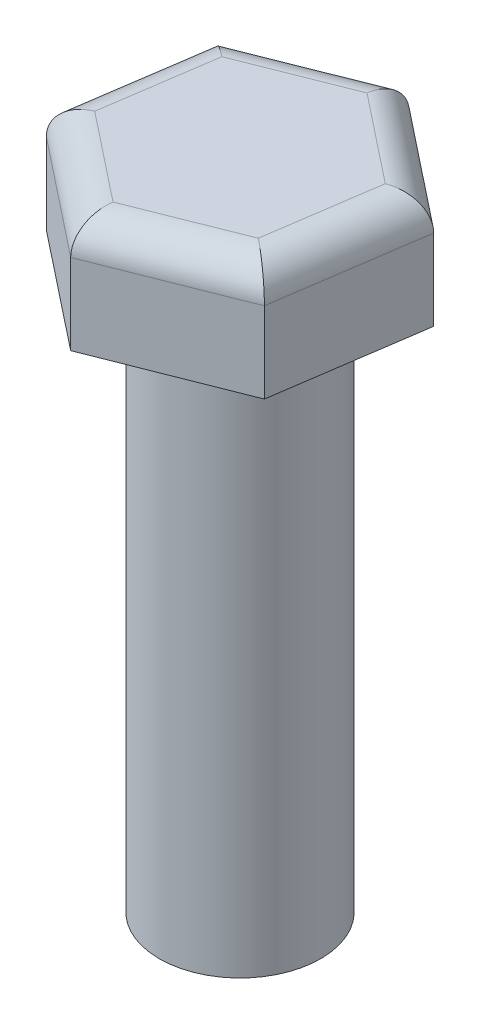
ISO-10303-21;
HEADER;
FILE_DESCRIPTION(('STEP AP214'),'2;1');
FILE_NAME('part.step','',(''),(''),'','','');
FILE_SCHEMA(('AUTOMOTIVE_DESIGN { 1 0 10303 214 1 1 1 1 }'));
ENDSEC;
DATA;
#1=APPLICATION_CONTEXT('core data for automotive mechanical design processes');
#2=APPLICATION_PROTOCOL_DEFINITION('international standard','automotive_design',2000,#1);
#3=PRODUCT_CONTEXT('',#1,'mechanical');
#4=PRODUCT('Part','Part','',(#3));
#5=PRODUCT_RELATED_PRODUCT_CATEGORY('part','',(#4));
#6=PRODUCT_DEFINITION_FORMATION('','',#4);
#7=PRODUCT_DEFINITION_CONTEXT('part definition',#1,'design');
#8=PRODUCT_DEFINITION('design','',#6,#7);
#9=PRODUCT_DEFINITION_SHAPE('','',#8);
#10=(LENGTH_UNIT() NAMED_UNIT(*) SI_UNIT(.MILLI.,.METRE.));
#11=(NAMED_UNIT(*) PLANE_ANGLE_UNIT() SI_UNIT($,.RADIAN.));
#12=(NAMED_UNIT(*) SI_UNIT($,.STERADIAN.) SOLID_ANGLE_UNIT());
#13=UNCERTAINTY_MEASURE_WITH_UNIT(LENGTH_MEASURE(1.E-05),#10,'distance_accuracy_value','');
#14=(GEOMETRIC_REPRESENTATION_CONTEXT(3) GLOBAL_UNCERTAINTY_ASSIGNED_CONTEXT((#13)) GLOBAL_UNIT_ASSIGNED_CONTEXT((#10,
#11,#12)) REPRESENTATION_CONTEXT('',''));
#15=CARTESIAN_POINT('',(0.,0.,0.));
#16=DIRECTION('',(0.,0.,1.));
#17=DIRECTION('',(1.,0.,0.));
#18=AXIS2_PLACEMENT_3D('',#15,#16,#17);
#19=CARTESIAN_POINT('',(0.,17.,0.));
#20=DIRECTION('',(0.,-1.,0.));
#21=DIRECTION('',(0.,0.,-1.));
#22=AXIS2_PLACEMENT_3D('',#19,#20,#21);
#23=CYLINDRICAL_SURFACE('',#22,2.5);
#24=CARTESIAN_POINT('',(0.,17.,0.));
#25=DIRECTION('',(0.,1.,0.));
#26=DIRECTION('',(0.,0.,1.));
#27=AXIS2_PLACEMENT_3D('',#24,#25,#26);
#28=CIRCLE('',#27,2.5);
#29=CARTESIAN_POINT('',(0.,17.,2.5));
#30=VERTEX_POINT('',#29);
#31=EDGE_CURVE('E151',#30,#30,#28,.T.);
#32=ORIENTED_EDGE('',*,*,#31,.F.);
#33=EDGE_LOOP('',(#32));
#34=FACE_BOUND('',#33,.T.);
#35=CARTESIAN_POINT('',(0.,0.,0.));
#36=DIRECTION('',(0.,1.,0.));
#37=DIRECTION('',(0.,0.,1.));
#38=AXIS2_PLACEMENT_3D('',#35,#36,#37);
#39=CIRCLE('',#38,2.5);
#40=CARTESIAN_POINT('',(0.,0.,2.5));
#41=VERTEX_POINT('',#40);
#42=EDGE_CURVE('E114',#41,#41,#39,.T.);
#43=ORIENTED_EDGE('',*,*,#42,.T.);
#44=EDGE_LOOP('',(#43));
#45=FACE_BOUND('',#44,.T.);
#46=ADVANCED_FACE('F31',(#34,#45),#23,.T.);
#47=CARTESIAN_POINT('',(0.,0.,0.));
#48=DIRECTION('',(0.,1.,0.));
#49=DIRECTION('',(0.,0.,1.));
#50=AXIS2_PLACEMENT_3D('',#47,#48,#49);
#51=PLANE('',#50);
#52=ORIENTED_EDGE('',*,*,#42,.F.);
#53=EDGE_LOOP('',(#52));
#54=FACE_BOUND('',#53,.T.);
#55=ADVANCED_FACE('F226',(#54),#51,.F.);
#56=CARTESIAN_POINT('',(3.62143570471053,17.,2.86679904597115));
#57=DIRECTION('',(0.,1.,0.));
#58=DIRECTION('',(0.,0.,1.));
#59=AXIS2_PLACEMENT_3D('',#56,#57,#58);
#60=PLANE('',#59);
#61=DIRECTION('',(0.929556735926005,0.,-0.368679094463723));
#62=VECTOR('',#61,1.);
#63=CARTESIAN_POINT('',(-0.672002949000746,17.,4.56965484143689));
#64=LINE('',#63,#62);
#65=CARTESIAN_POINT('',(-0.672002949000746,17.,4.56965484143689));
#66=VERTEX_POINT('',#65);
#67=CARTESIAN_POINT('',(3.62143570471053,17.,2.86679904597115));
#68=VERTEX_POINT('',#67);
#69=EDGE_CURVE('E122',#66,#68,#64,.T.);
#70=ORIENTED_EDGE('',*,*,#69,.F.);
#71=DIRECTION('',(0.784063829612829,0.,0.620680200339002));
#72=VECTOR('',#71,1.);
#73=CARTESIAN_POINT('',(-4.29343865371127,17.,1.70285579546574));
#74=LINE('',#73,#72);
#75=CARTESIAN_POINT('',(-4.29343865371127,17.,1.70285579546574));
#76=VERTEX_POINT('',#75);
#77=EDGE_CURVE('E141',#76,#66,#74,.T.);
#78=ORIENTED_EDGE('',*,*,#77,.F.);
#79=DIRECTION('',(-0.145492906313176,0.,0.989359294802725));
#80=VECTOR('',#79,1.);
#81=CARTESIAN_POINT('',(-3.62143570471053,17.,-2.86679904597115));
#82=LINE('',#81,#80);
#83=CARTESIAN_POINT('',(-3.62143570471053,17.,-2.86679904597115));
#84=VERTEX_POINT('',#83);
#85=EDGE_CURVE('E138',#84,#76,#82,.T.);
#86=ORIENTED_EDGE('',*,*,#85,.F.);
#87=DIRECTION('',(-0.929556735926005,0.,0.368679094463723));
#88=VECTOR('',#87,1.);
#89=CARTESIAN_POINT('',(0.672002949000745,17.,-4.56965484143689));
#90=LINE('',#89,#88);
#91=CARTESIAN_POINT('',(0.672002949000745,17.,-4.56965484143689));
#92=VERTEX_POINT('',#91);
#93=EDGE_CURVE('E135',#92,#84,#90,.T.);
#94=ORIENTED_EDGE('',*,*,#93,.F.);
#95=DIRECTION('',(-0.78406382961283,0.,-0.620680200339002));
#96=VECTOR('',#95,1.);
#97=CARTESIAN_POINT('',(4.29343865371127,17.,-1.70285579546574));
#98=LINE('',#97,#96);
#99=CARTESIAN_POINT('',(4.29343865371127,17.,-1.70285579546574));
#100=VERTEX_POINT('',#99);
#101=EDGE_CURVE('E125',#100,#92,#98,.T.);
#102=ORIENTED_EDGE('',*,*,#101,.F.);
#103=DIRECTION('',(0.145492906313176,0.,-0.989359294802725));
#104=VECTOR('',#103,1.);
#105=CARTESIAN_POINT('',(3.62143570471053,17.,2.86679904597115));
#106=LINE('',#105,#104);
#107=EDGE_CURVE('E106',#68,#100,#106,.T.);
#108=ORIENTED_EDGE('',*,*,#107,.F.);
#109=EDGE_LOOP('',(#70,#78,#86,#94,#102,#108));
#110=FACE_BOUND('',#109,.T.);
#111=ORIENTED_EDGE('',*,*,#31,.T.);
#112=EDGE_LOOP('',(#111));
#113=FACE_BOUND('',#112,.T.);
#114=ADVANCED_FACE('F119',(#110,#113),#60,.F.);
#115=CARTESIAN_POINT('',(-0.672002949000746,20.5,4.56965484143689));
#116=DIRECTION('',(-0.368679094463723,0.,-0.929556735926005));
#117=DIRECTION('',(-0.929556735926006,0.,0.368679094463723));
#118=AXIS2_PLACEMENT_3D('',#115,#116,#117);
#119=PLANE('',#118);
#120=DIRECTION('',(0.,-1.,0.));
#121=VECTOR('',#120,1.);
#122=CARTESIAN_POINT('',(3.62143570471053,20.5,2.86679904597115));
#123=LINE('',#122,#121);
#124=CARTESIAN_POINT('',(3.62143570471053,19.5,2.86679904597115));
#125=VERTEX_POINT('',#124);
#126=EDGE_CURVE('E102',#125,#68,#123,.T.);
#127=ORIENTED_EDGE('',*,*,#126,.F.);
#128=DIRECTION('',(0.929556735926006,0.,-0.368679094463723));
#129=VECTOR('',#128,1.);
#130=CARTESIAN_POINT('',(-0.672002949000747,19.5,4.5696548414369));
#131=LINE('',#130,#129);
#132=CARTESIAN_POINT('',(-0.672002949000746,19.5,4.56965484143689));
#133=VERTEX_POINT('',#132);
#134=EDGE_CURVE('E169',#125,#133,#131,.F.);
#135=ORIENTED_EDGE('',*,*,#134,.T.);
#136=DIRECTION('',(0.,-1.,0.));
#137=VECTOR('',#136,1.);
#138=CARTESIAN_POINT('',(-0.672002949000746,20.5,4.56965484143689));
#139=LINE('',#138,#137);
#140=EDGE_CURVE('E128',#133,#66,#139,.T.);
#141=ORIENTED_EDGE('',*,*,#140,.T.);
#142=ORIENTED_EDGE('',*,*,#69,.T.);
#143=EDGE_LOOP('',(#127,#135,#141,#142));
#144=FACE_BOUND('',#143,.T.);
#145=ADVANCED_FACE('F127',(#144),#119,.F.);
#146=CARTESIAN_POINT('',(3.62143570471053,20.5,2.86679904597115));
#147=DIRECTION('',(-0.989359294802725,0.,-0.145492906313176));
#148=DIRECTION('',(-0.145492906313176,0.,0.989359294802725));
#149=AXIS2_PLACEMENT_3D('',#146,#147,#148);
#150=PLANE('',#149);
#151=DIRECTION('',(0.,-1.,0.));
#152=VECTOR('',#151,1.);
#153=CARTESIAN_POINT('',(4.29343865371127,20.5,-1.70285579546574));
#154=LINE('',#153,#152);
#155=CARTESIAN_POINT('',(4.29343865371127,19.5,-1.70285579546574));
#156=VERTEX_POINT('',#155);
#157=EDGE_CURVE('E115',#156,#100,#154,.T.);
#158=ORIENTED_EDGE('',*,*,#157,.F.);
#159=DIRECTION('',(0.145492906313176,0.,-0.989359294802725));
#160=VECTOR('',#159,1.);
#161=CARTESIAN_POINT('',(3.62143570471053,19.5,2.86679904597115));
#162=LINE('',#161,#160);
#163=EDGE_CURVE('E109',#156,#125,#162,.F.);
#164=ORIENTED_EDGE('',*,*,#163,.T.);
#165=ORIENTED_EDGE('',*,*,#126,.T.);
#166=ORIENTED_EDGE('',*,*,#107,.T.);
#167=EDGE_LOOP('',(#158,#164,#165,#166));
#168=FACE_BOUND('',#167,.T.);
#169=ADVANCED_FACE('F105',(#168),#150,.F.);
#170=CARTESIAN_POINT('',(4.29343865371127,20.5,-1.70285579546574));
#171=DIRECTION('',(-0.620680200339002,0.,0.78406382961283));
#172=DIRECTION('',(0.78406382961283,0.,0.620680200339002));
#173=AXIS2_PLACEMENT_3D('',#170,#171,#172);
#174=PLANE('',#173);
#175=DIRECTION('',(0.,-1.,0.));
#176=VECTOR('',#175,1.);
#177=CARTESIAN_POINT('',(0.672002949000745,20.5,-4.56965484143689));
#178=LINE('',#177,#176);
#179=CARTESIAN_POINT('',(0.672002949000745,19.5,-4.56965484143689));
#180=VERTEX_POINT('',#179);
#181=EDGE_CURVE('E148',#180,#92,#178,.T.);
#182=ORIENTED_EDGE('',*,*,#181,.F.);
#183=DIRECTION('',(-0.78406382961283,0.,-0.620680200339002));
#184=VECTOR('',#183,1.);
#185=CARTESIAN_POINT('',(4.29343865371127,19.5,-1.70285579546574));
#186=LINE('',#185,#184);
#187=EDGE_CURVE('E172',#180,#156,#186,.F.);
#188=ORIENTED_EDGE('',*,*,#187,.T.);
#189=ORIENTED_EDGE('',*,*,#157,.T.);
#190=ORIENTED_EDGE('',*,*,#101,.T.);
#191=EDGE_LOOP('',(#182,#188,#189,#190));
#192=FACE_BOUND('',#191,.T.);
#193=ADVANCED_FACE('F216',(#192),#174,.F.);
#194=CARTESIAN_POINT('',(0.672002949000745,20.5,-4.56965484143689));
#195=DIRECTION('',(0.368679094463723,0.,0.929556735926005));
#196=DIRECTION('',(0.929556735926006,0.,-0.368679094463723));
#197=AXIS2_PLACEMENT_3D('',#194,#195,#196);
#198=PLANE('',#197);
#199=DIRECTION('',(0.,-1.,0.));
#200=VECTOR('',#199,1.);
#201=CARTESIAN_POINT('',(-3.62143570471053,20.5,-2.86679904597115));
#202=LINE('',#201,#200);
#203=CARTESIAN_POINT('',(-3.62143570471053,19.5,-2.86679904597115));
#204=VERTEX_POINT('',#203);
#205=EDGE_CURVE('E146',#204,#84,#202,.T.);
#206=ORIENTED_EDGE('',*,*,#205,.F.);
#207=DIRECTION('',(-0.929556735926006,0.,0.368679094463723));
#208=VECTOR('',#207,1.);
#209=CARTESIAN_POINT('',(0.672002949000745,19.5,-4.56965484143689));
#210=LINE('',#209,#208);
#211=EDGE_CURVE('E174',#204,#180,#210,.F.);
#212=ORIENTED_EDGE('',*,*,#211,.T.);
#213=ORIENTED_EDGE('',*,*,#181,.T.);
#214=ORIENTED_EDGE('',*,*,#93,.T.);
#215=EDGE_LOOP('',(#206,#212,#213,#214));
#216=FACE_BOUND('',#215,.T.);
#217=ADVANCED_FACE('F213',(#216),#198,.F.);
#218=CARTESIAN_POINT('',(-3.62143570471053,20.5,-2.86679904597115));
#219=DIRECTION('',(0.989359294802725,0.,0.145492906313176));
#220=DIRECTION('',(0.145492906313176,0.,-0.989359294802725));
#221=AXIS2_PLACEMENT_3D('',#218,#219,#220);
#222=PLANE('',#221);
#223=DIRECTION('',(0.,-1.,0.));
#224=VECTOR('',#223,1.);
#225=CARTESIAN_POINT('',(-4.29343865371127,20.5,1.70285579546574));
#226=LINE('',#225,#224);
#227=CARTESIAN_POINT('',(-4.29343865371127,19.5,1.70285579546574));
#228=VERTEX_POINT('',#227);
#229=EDGE_CURVE('E144',#228,#76,#226,.T.);
#230=ORIENTED_EDGE('',*,*,#229,.F.);
#231=DIRECTION('',(-0.145492906313176,0.,0.989359294802725));
#232=VECTOR('',#231,1.);
#233=CARTESIAN_POINT('',(-3.62143570471053,19.5,-2.86679904597115));
#234=LINE('',#233,#232);
#235=EDGE_CURVE('E40',#228,#204,#234,.F.);
#236=ORIENTED_EDGE('',*,*,#235,.T.);
#237=ORIENTED_EDGE('',*,*,#205,.T.);
#238=ORIENTED_EDGE('',*,*,#85,.T.);
#239=EDGE_LOOP('',(#230,#236,#237,#238));
#240=FACE_BOUND('',#239,.T.);
#241=ADVANCED_FACE('F211',(#240),#222,.F.);
#242=CARTESIAN_POINT('',(-4.29343865371127,20.5,1.70285579546574));
#243=DIRECTION('',(0.620680200339002,0.,-0.784063829612829));
#244=DIRECTION('',(-0.784063829612829,0.,-0.620680200339002));
#245=AXIS2_PLACEMENT_3D('',#242,#243,#244);
#246=PLANE('',#245);
#247=ORIENTED_EDGE('',*,*,#140,.F.);
#248=DIRECTION('',(0.784063829612829,0.,0.620680200339002));
#249=VECTOR('',#248,1.);
#250=CARTESIAN_POINT('',(-4.29343865371127,19.5,1.70285579546574));
#251=LINE('',#250,#249);
#252=EDGE_CURVE('E11',#133,#228,#251,.F.);
#253=ORIENTED_EDGE('',*,*,#252,.T.);
#254=ORIENTED_EDGE('',*,*,#229,.T.);
#255=ORIENTED_EDGE('',*,*,#77,.T.);
#256=EDGE_LOOP('',(#247,#253,#254,#255));
#257=FACE_BOUND('',#256,.T.);
#258=ADVANCED_FACE('F209',(#257),#246,.F.);
#259=CARTESIAN_POINT('',(3.62143570471053,20.5,2.86679904597115));
#260=DIRECTION('',(0.,1.,0.));
#261=DIRECTION('',(0.,0.,1.));
#262=AXIS2_PLACEMENT_3D('',#259,#260,#261);
#263=PLANE('',#262);
#264=DIRECTION('',(0.784063829612829,0.,0.620680200339002));
#265=VECTOR('',#264,1.);
#266=CARTESIAN_POINT('',(-0.0513227486617434,20.5,3.78559101182407));
#267=LINE('',#266,#265);
#268=CARTESIAN_POINT('',(-3.22007899028345,20.5,1.27714184659931));
#269=VERTEX_POINT('',#268);
#270=CARTESIAN_POINT('',(-0.50400221175056,20.5,3.42724113107767));
#271=VERTEX_POINT('',#270);
#272=EDGE_CURVE('E154',#269,#271,#267,.T.);
#273=ORIENTED_EDGE('',*,*,#272,.T.);
#274=DIRECTION('',(0.929556735926006,0.,-0.368679094463723));
#275=VECTOR('',#274,1.);
#276=CARTESIAN_POINT('',(3.25275661024681,20.5,1.93724231004515));
#277=LINE('',#276,#275);
#278=CARTESIAN_POINT('',(2.7160767785329,20.5,2.15009928447836));
#279=VERTEX_POINT('',#278);
#280=EDGE_CURVE('E166',#271,#279,#277,.T.);
#281=ORIENTED_EDGE('',*,*,#280,.T.);
#282=DIRECTION('',(0.145492906313176,0.,-0.989359294802725));
#283=VECTOR('',#282,1.);
#284=CARTESIAN_POINT('',(3.30407935890855,20.5,-1.84834870177892));
#285=LINE('',#284,#283);
#286=CARTESIAN_POINT('',(3.22007899028345,20.5,-1.27714184659931));
#287=VERTEX_POINT('',#286);
#288=EDGE_CURVE('E164',#279,#287,#285,.T.);
#289=ORIENTED_EDGE('',*,*,#288,.T.);
#290=DIRECTION('',(-0.78406382961283,0.,-0.620680200339002));
#291=VECTOR('',#290,1.);
#292=CARTESIAN_POINT('',(0.0513227486617432,20.5,-3.78559101182406));
#293=LINE('',#292,#291);
#294=CARTESIAN_POINT('',(0.504002211750558,20.5,-3.42724113107767));
#295=VERTEX_POINT('',#294);
#296=EDGE_CURVE('E162',#287,#295,#293,.T.);
#297=ORIENTED_EDGE('',*,*,#296,.T.);
#298=DIRECTION('',(-0.929556735926006,0.,0.368679094463723));
#299=VECTOR('',#298,1.);
#300=CARTESIAN_POINT('',(-3.25275661024681,20.5,-1.93724231004515));
#301=LINE('',#300,#299);
#302=CARTESIAN_POINT('',(-2.7160767785329,20.5,-2.15009928447836));
#303=VERTEX_POINT('',#302);
#304=EDGE_CURVE('E160',#295,#303,#301,.T.);
#305=ORIENTED_EDGE('',*,*,#304,.T.);
#306=DIRECTION('',(-0.145492906313176,0.,0.989359294802725));
#307=VECTOR('',#306,1.);
#308=CARTESIAN_POINT('',(-3.30407935890855,20.5,1.84834870177892));
#309=LINE('',#308,#307);
#310=EDGE_CURVE('E158',#303,#269,#309,.T.);
#311=ORIENTED_EDGE('',*,*,#310,.T.);
#312=EDGE_LOOP('',(#273,#281,#289,#297,#305,#311));
#313=FACE_BOUND('',#312,.T.);
#314=ADVANCED_FACE('F199',(#313),#263,.T.);
#315=CARTESIAN_POINT('',(1.04068204346447,19.5,-3.64009810551089));
#316=DIRECTION('',(0.929556735926006,0.,-0.368679094463723));
#317=DIRECTION('',(-0.368679094463723,0.,-0.929556735926006));
#318=AXIS2_PLACEMENT_3D('',#315,#316,#317);
#319=CYLINDRICAL_SURFACE('',#318,1.);
#320=CARTESIAN_POINT('',(0.504002211750557,19.5,-3.42724113107767));
#321=DIRECTION('',(0.989359294802725,0.,0.145492906313176));
#322=DIRECTION('',(0.145492906313176,0.,-0.989359294802725));
#323=AXIS2_PLACEMENT_3D('',#320,#321,#322);
#324=ELLIPSE('',#323,1.15470053837925,1.);
#325=EDGE_CURVE('E132',#180,#295,#324,.T.);
#326=ORIENTED_EDGE('',*,*,#325,.F.);
#327=ORIENTED_EDGE('',*,*,#211,.F.);
#328=CARTESIAN_POINT('',(-2.7160767785329,19.5,-2.15009928447836));
#329=DIRECTION('',(0.620680200339002,0.,-0.784063829612829));
#330=DIRECTION('',(-0.784063829612829,0.,-0.620680200339002));
#331=AXIS2_PLACEMENT_3D('',#328,#329,#330);
#332=ELLIPSE('',#331,1.15470053837925,1.);
#333=EDGE_CURVE('E35',#303,#204,#332,.F.);
#334=ORIENTED_EDGE('',*,*,#333,.F.);
#335=ORIENTED_EDGE('',*,*,#304,.F.);
#336=EDGE_LOOP('',(#326,#327,#334,#335));
#337=FACE_BOUND('',#336,.T.);
#338=ADVANCED_FACE('F33',(#337),#319,.T.);
#339=CARTESIAN_POINT('',(-3.30407935890855,19.5,1.84834870177892));
#340=DIRECTION('',(0.145492906313176,0.,-0.989359294802725));
#341=DIRECTION('',(-0.989359294802725,0.,-0.145492906313176));
#342=AXIS2_PLACEMENT_3D('',#339,#340,#341);
#343=CYLINDRICAL_SURFACE('',#342,1.);
#344=ORIENTED_EDGE('',*,*,#333,.T.);
#345=ORIENTED_EDGE('',*,*,#235,.F.);
#346=CARTESIAN_POINT('',(-3.22007899028345,19.5,1.27714184659931));
#347=DIRECTION('',(-0.368679094463723,0.,-0.929556735926005));
#348=DIRECTION('',(-0.929556735926006,0.,0.368679094463723));
#349=AXIS2_PLACEMENT_3D('',#346,#347,#348);
#350=ELLIPSE('',#349,1.15470053837925,1.);
#351=EDGE_CURVE('E184',#269,#228,#350,.F.);
#352=ORIENTED_EDGE('',*,*,#351,.F.);
#353=ORIENTED_EDGE('',*,*,#310,.F.);
#354=EDGE_LOOP('',(#344,#345,#352,#353));
#355=FACE_BOUND('',#354,.T.);
#356=ADVANCED_FACE('F247',(#355),#343,.T.);
#357=CARTESIAN_POINT('',(5.48347630572753,19.5,0.514607557132661));
#358=DIRECTION('',(0.78406382961283,0.,0.620680200339002));
#359=DIRECTION('',(0.620680200339002,0.,-0.78406382961283));
#360=AXIS2_PLACEMENT_3D('',#357,#358,#359);
#361=CYLINDRICAL_SURFACE('',#360,1.);
#362=ORIENTED_EDGE('',*,*,#325,.T.);
#363=ORIENTED_EDGE('',*,*,#296,.F.);
#364=CARTESIAN_POINT('',(3.22007899028345,19.5,-1.27714184659931));
#365=DIRECTION('',(0.368679094463723,0.,0.929556735926006));
#366=DIRECTION('',(0.929556735926005,0.,-0.368679094463723));
#367=AXIS2_PLACEMENT_3D('',#364,#365,#366);
#368=ELLIPSE('',#367,1.15470053837925,1.);
#369=EDGE_CURVE('E181',#156,#287,#368,.T.);
#370=ORIENTED_EDGE('',*,*,#369,.F.);
#371=ORIENTED_EDGE('',*,*,#187,.F.);
#372=EDGE_LOOP('',(#362,#363,#370,#371));
#373=FACE_BOUND('',#372,.T.);
#374=ADVANCED_FACE('F191',(#373),#361,.T.);
#375=CARTESIAN_POINT('',(1.75939510369352,19.5,5.21899053480964));
#376=DIRECTION('',(-0.784063829612829,0.,-0.620680200339002));
#377=DIRECTION('',(-0.620680200339002,0.,0.784063829612829));
#378=AXIS2_PLACEMENT_3D('',#375,#376,#377);
#379=CYLINDRICAL_SURFACE('',#378,1.);
#380=ORIENTED_EDGE('',*,*,#351,.T.);
#381=ORIENTED_EDGE('',*,*,#252,.F.);
#382=CARTESIAN_POINT('',(-0.50400221175056,19.5,3.42724113107767));
#383=DIRECTION('',(-0.989359294802725,0.,-0.145492906313176));
#384=DIRECTION('',(0.145492906313176,0.,-0.989359294802725));
#385=AXIS2_PLACEMENT_3D('',#382,#383,#384);
#386=ELLIPSE('',#385,1.15470053837925,1.);
#387=EDGE_CURVE('E179',#271,#133,#386,.F.);
#388=ORIENTED_EDGE('',*,*,#387,.F.);
#389=ORIENTED_EDGE('',*,*,#272,.F.);
#390=EDGE_LOOP('',(#380,#381,#388,#389));
#391=FACE_BOUND('',#390,.T.);
#392=ADVANCED_FACE('F242',(#391),#379,.T.);
#393=CARTESIAN_POINT('',(2.6320764099078,19.5,2.72130613965797));
#394=DIRECTION('',(-0.145492906313176,0.,0.989359294802725));
#395=DIRECTION('',(0.989359294802725,0.,0.145492906313176));
#396=AXIS2_PLACEMENT_3D('',#393,#394,#395);
#397=CYLINDRICAL_SURFACE('',#396,1.);
#398=ORIENTED_EDGE('',*,*,#369,.T.);
#399=ORIENTED_EDGE('',*,*,#288,.F.);
#400=CARTESIAN_POINT('',(2.7160767785329,19.5,2.15009928447836));
#401=DIRECTION('',(-0.620680200339002,0.,0.784063829612829));
#402=DIRECTION('',(0.784063829612829,0.,0.620680200339002));
#403=AXIS2_PLACEMENT_3D('',#400,#401,#402);
#404=ELLIPSE('',#403,1.15470053837925,1.);
#405=EDGE_CURVE('E177',#125,#279,#404,.T.);
#406=ORIENTED_EDGE('',*,*,#405,.F.);
#407=ORIENTED_EDGE('',*,*,#163,.F.);
#408=EDGE_LOOP('',(#398,#399,#406,#407));
#409=FACE_BOUND('',#408,.T.);
#410=ADVANCED_FACE('F205',(#409),#397,.T.);
#411=CARTESIAN_POINT('',(3.25275661024681,19.5,1.93724231004515));
#412=DIRECTION('',(-0.929556735926006,0.,0.368679094463723));
#413=DIRECTION('',(0.368679094463723,0.,0.929556735926006));
#414=AXIS2_PLACEMENT_3D('',#411,#412,#413);
#415=CYLINDRICAL_SURFACE('',#414,1.);
#416=ORIENTED_EDGE('',*,*,#387,.T.);
#417=ORIENTED_EDGE('',*,*,#134,.F.);
#418=ORIENTED_EDGE('',*,*,#405,.T.);
#419=ORIENTED_EDGE('',*,*,#280,.F.);
#420=EDGE_LOOP('',(#416,#417,#418,#419));
#421=FACE_BOUND('',#420,.T.);
#422=ADVANCED_FACE('F207',(#421),#415,.T.);
#423=CLOSED_SHELL('',(#46,#55,#114,#145,#169,#193,#217,#241,#258,#314,#338,#356,#374,#392,#410,#422));
#424=MANIFOLD_SOLID_BREP('B2',#423);
#425=ADVANCED_BREP_SHAPE_REPRESENTATION('',(#18,#424),#14);
#426=SHAPE_DEFINITION_REPRESENTATION(#9,#425);
ENDSEC;
END-ISO-10303-21;
